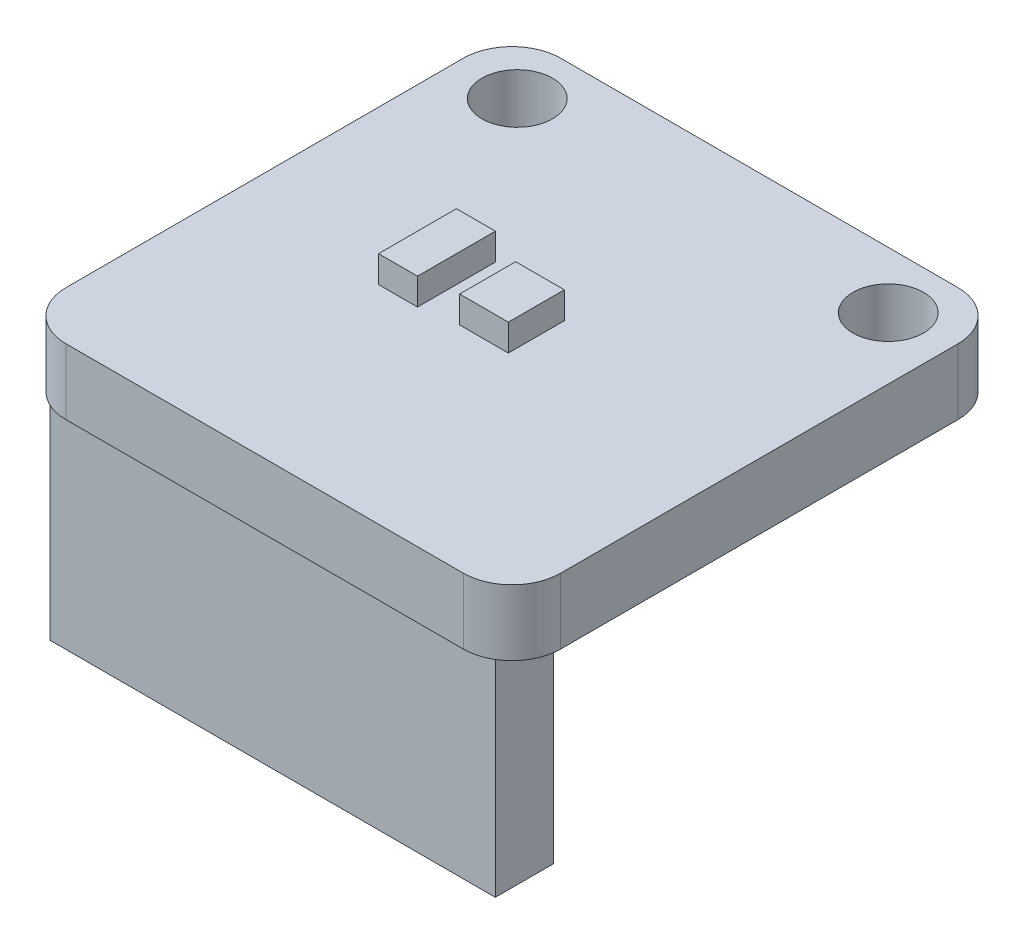
ISO-10303-21;
HEADER;
FILE_DESCRIPTION(('STEP AP214'),'2;1');
FILE_NAME('part.step','',(''),(''),'','','');
FILE_SCHEMA(('AUTOMOTIVE_DESIGN { 1 0 10303 214 1 1 1 1 }'));
ENDSEC;
DATA;
#1=APPLICATION_CONTEXT('core data for automotive mechanical design processes');
#2=APPLICATION_PROTOCOL_DEFINITION('international standard','automotive_design',2000,#1);
#3=PRODUCT_CONTEXT('',#1,'mechanical');
#4=PRODUCT('Part','Part','',(#3));
#5=PRODUCT_RELATED_PRODUCT_CATEGORY('part','',(#4));
#6=PRODUCT_DEFINITION_FORMATION('','',#4);
#7=PRODUCT_DEFINITION_CONTEXT('part definition',#1,'design');
#8=PRODUCT_DEFINITION('design','',#6,#7);
#9=PRODUCT_DEFINITION_SHAPE('','',#8);
#10=(LENGTH_UNIT() NAMED_UNIT(*) SI_UNIT(.MILLI.,.METRE.));
#11=(NAMED_UNIT(*) PLANE_ANGLE_UNIT() SI_UNIT($,.RADIAN.));
#12=(NAMED_UNIT(*) SI_UNIT($,.STERADIAN.) SOLID_ANGLE_UNIT());
#13=UNCERTAINTY_MEASURE_WITH_UNIT(LENGTH_MEASURE(1.E-05),#10,'distance_accuracy_value','');
#14=(GEOMETRIC_REPRESENTATION_CONTEXT(3) GLOBAL_UNCERTAINTY_ASSIGNED_CONTEXT((#13)) GLOBAL_UNIT_ASSIGNED_CONTEXT((#10,
#11,#12)) REPRESENTATION_CONTEXT('',''));
#15=CARTESIAN_POINT('',(0.,0.,0.));
#16=DIRECTION('',(0.,0.,1.));
#17=DIRECTION('',(1.,0.,0.));
#18=AXIS2_PLACEMENT_3D('',#15,#16,#17);
#19=CARTESIAN_POINT('',(0.,2.7,0.));
#20=DIRECTION('',(0.,-1.,0.));
#21=DIRECTION('',(0.,0.,-1.));
#22=AXIS2_PLACEMENT_3D('',#19,#20,#21);
#23=PLANE('',#22);
#24=DIRECTION('',(0.,0.,1.));
#25=VECTOR('',#24,1.);
#26=CARTESIAN_POINT('',(-0.745999999999998,2.7,-0.896000000000001));
#27=LINE('',#26,#25);
#28=CARTESIAN_POINT('',(-0.745999999999998,2.7,-0.896000000000001));
#29=VERTEX_POINT('',#28);
#30=CARTESIAN_POINT('',(-0.745999999999998,2.7,1.404));
#31=VERTEX_POINT('',#30);
#32=EDGE_CURVE('E249',#29,#31,#27,.T.);
#33=ORIENTED_EDGE('',*,*,#32,.F.);
#34=DIRECTION('',(-1.,0.,0.));
#35=VECTOR('',#34,1.);
#36=CARTESIAN_POINT('',(-0.745999999999998,2.7,-0.896000000000001));
#37=LINE('',#36,#35);
#38=CARTESIAN_POINT('',(1.254,2.7,-0.896000000000001));
#39=VERTEX_POINT('',#38);
#40=EDGE_CURVE('E254',#39,#29,#37,.T.);
#41=ORIENTED_EDGE('',*,*,#40,.F.);
#42=DIRECTION('',(0.,0.,-1.));
#43=VECTOR('',#42,1.);
#44=CARTESIAN_POINT('',(1.254,2.7,-0.896000000000001));
#45=LINE('',#44,#43);
#46=CARTESIAN_POINT('',(1.254,2.7,1.404));
#47=VERTEX_POINT('',#46);
#48=EDGE_CURVE('E266',#47,#39,#45,.T.);
#49=ORIENTED_EDGE('',*,*,#48,.F.);
#50=DIRECTION('',(1.,0.,0.));
#51=VECTOR('',#50,1.);
#52=CARTESIAN_POINT('',(-0.745999999999998,2.7,1.404));
#53=LINE('',#52,#51);
#54=EDGE_CURVE('E263',#31,#47,#53,.T.);
#55=ORIENTED_EDGE('',*,*,#54,.F.);
#56=EDGE_LOOP('',(#33,#41,#49,#55));
#57=FACE_BOUND('',#56,.T.);
#58=CARTESIAN_POINT('',(-7.62,2.7,-7.83500067424431));
#59=DIRECTION('',(0.,1.,0.));
#60=DIRECTION('',(0.,0.,1.));
#61=AXIS2_PLACEMENT_3D('',#58,#59,#60);
#62=CIRCLE('',#61,1.45);
#63=CARTESIAN_POINT('',(-7.62,2.7,-6.38500067424432));
#64=VERTEX_POINT('',#63);
#65=EDGE_CURVE('E282',#64,#64,#62,.T.);
#66=ORIENTED_EDGE('',*,*,#65,.F.);
#67=EDGE_LOOP('',(#66));
#68=FACE_BOUND('',#67,.T.);
#69=CARTESIAN_POINT('',(7.62,2.7,-7.83500067424431));
#70=DIRECTION('',(0.,1.,0.));
#71=DIRECTION('',(0.,0.,1.));
#72=AXIS2_PLACEMENT_3D('',#69,#70,#71);
#73=CIRCLE('',#72,1.45);
#74=CARTESIAN_POINT('',(7.62,2.7,-6.38500067424432));
#75=VERTEX_POINT('',#74);
#76=EDGE_CURVE('E288',#75,#75,#73,.T.);
#77=ORIENTED_EDGE('',*,*,#76,.F.);
#78=EDGE_LOOP('',(#77));
#79=FACE_BOUND('',#78,.T.);
#80=DIRECTION('',(0.,0.,1.));
#81=VECTOR('',#80,1.);
#82=CARTESIAN_POINT('',(-10.16,2.7,10.16));
#83=LINE('',#82,#81);
#84=CARTESIAN_POINT('',(-10.16,2.7,-8.16));
#85=VERTEX_POINT('',#84);
#86=CARTESIAN_POINT('',(-10.16,2.7,8.16));
#87=VERTEX_POINT('',#86);
#88=EDGE_CURVE('E295',#85,#87,#83,.T.);
#89=ORIENTED_EDGE('',*,*,#88,.T.);
#90=CARTESIAN_POINT('',(-8.16,2.7,8.16));
#91=DIRECTION('',(0.,-1.,0.));
#92=DIRECTION('',(0.,0.,-1.));
#93=AXIS2_PLACEMENT_3D('',#90,#91,#92);
#94=CIRCLE('',#93,2.);
#95=CARTESIAN_POINT('',(-8.16,2.7,10.16));
#96=VERTEX_POINT('',#95);
#97=EDGE_CURVE('E338',#87,#96,#94,.F.);
#98=ORIENTED_EDGE('',*,*,#97,.T.);
#99=DIRECTION('',(1.,0.,0.));
#100=VECTOR('',#99,1.);
#101=CARTESIAN_POINT('',(-10.16,2.7,10.16));
#102=LINE('',#101,#100);
#103=CARTESIAN_POINT('',(8.16,2.7,10.16));
#104=VERTEX_POINT('',#103);
#105=EDGE_CURVE('E298',#96,#104,#102,.T.);
#106=ORIENTED_EDGE('',*,*,#105,.T.);
#107=CARTESIAN_POINT('',(8.16,2.7,8.16));
#108=DIRECTION('',(0.,-1.,0.));
#109=DIRECTION('',(0.,0.,-1.));
#110=AXIS2_PLACEMENT_3D('',#107,#108,#109);
#111=CIRCLE('',#110,2.);
#112=CARTESIAN_POINT('',(10.16,2.7,8.16));
#113=VERTEX_POINT('',#112);
#114=EDGE_CURVE('E336',#104,#113,#111,.F.);
#115=ORIENTED_EDGE('',*,*,#114,.T.);
#116=DIRECTION('',(0.,0.,-1.));
#117=VECTOR('',#116,1.);
#118=CARTESIAN_POINT('',(10.16,2.7,10.16));
#119=LINE('',#118,#117);
#120=CARTESIAN_POINT('',(10.16,2.7,-8.16));
#121=VERTEX_POINT('',#120);
#122=EDGE_CURVE('E302',#113,#121,#119,.T.);
#123=ORIENTED_EDGE('',*,*,#122,.T.);
#124=CARTESIAN_POINT('',(8.16,2.7,-8.16));
#125=DIRECTION('',(0.,-1.,0.));
#126=DIRECTION('',(0.,0.,-1.));
#127=AXIS2_PLACEMENT_3D('',#124,#125,#126);
#128=CIRCLE('',#127,2.);
#129=CARTESIAN_POINT('',(8.16,2.7,-10.16));
#130=VERTEX_POINT('',#129);
#131=EDGE_CURVE('E57',#121,#130,#128,.F.);
#132=ORIENTED_EDGE('',*,*,#131,.T.);
#133=DIRECTION('',(-1.,0.,0.));
#134=VECTOR('',#133,1.);
#135=CARTESIAN_POINT('',(-10.16,2.7,-10.16));
#136=LINE('',#135,#134);
#137=CARTESIAN_POINT('',(-8.16,2.7,-10.16));
#138=VERTEX_POINT('',#137);
#139=EDGE_CURVE('E304',#130,#138,#136,.T.);
#140=ORIENTED_EDGE('',*,*,#139,.T.);
#141=CARTESIAN_POINT('',(-8.16,2.7,-8.16));
#142=DIRECTION('',(0.,-1.,0.));
#143=DIRECTION('',(0.,0.,-1.));
#144=AXIS2_PLACEMENT_3D('',#141,#142,#143);
#145=CIRCLE('',#144,2.);
#146=EDGE_CURVE('E333',#138,#85,#145,.F.);
#147=ORIENTED_EDGE('',*,*,#146,.T.);
#148=EDGE_LOOP('',(#89,#98,#106,#115,#123,#132,#140,#147));
#149=FACE_BOUND('',#148,.T.);
#150=DIRECTION('',(0.,0.,1.));
#151=VECTOR('',#150,1.);
#152=CARTESIAN_POINT('',(-3.848,2.7,-1.566));
#153=LINE('',#152,#151);
#154=CARTESIAN_POINT('',(-3.848,2.7,-1.566));
#155=VERTEX_POINT('',#154);
#156=CARTESIAN_POINT('',(-3.848,2.7,1.634));
#157=VERTEX_POINT('',#156);
#158=EDGE_CURVE('E212',#155,#157,#153,.T.);
#159=ORIENTED_EDGE('',*,*,#158,.F.);
#160=DIRECTION('',(-1.,0.,0.));
#161=VECTOR('',#160,1.);
#162=CARTESIAN_POINT('',(-3.848,2.7,-1.566));
#163=LINE('',#162,#161);
#164=CARTESIAN_POINT('',(-2.248,2.7,-1.566));
#165=VERTEX_POINT('',#164);
#166=EDGE_CURVE('E221',#165,#155,#163,.T.);
#167=ORIENTED_EDGE('',*,*,#166,.F.);
#168=DIRECTION('',(0.,0.,-1.));
#169=VECTOR('',#168,1.);
#170=CARTESIAN_POINT('',(-2.248,2.7,-1.566));
#171=LINE('',#170,#169);
#172=CARTESIAN_POINT('',(-2.248,2.7,1.634));
#173=VERTEX_POINT('',#172);
#174=EDGE_CURVE('E233',#173,#165,#171,.T.);
#175=ORIENTED_EDGE('',*,*,#174,.F.);
#176=DIRECTION('',(1.,0.,0.));
#177=VECTOR('',#176,1.);
#178=CARTESIAN_POINT('',(-3.848,2.7,1.634));
#179=LINE('',#178,#177);
#180=EDGE_CURVE('E230',#157,#173,#179,.T.);
#181=ORIENTED_EDGE('',*,*,#180,.F.);
#182=EDGE_LOOP('',(#159,#167,#175,#181));
#183=FACE_BOUND('',#182,.T.);
#184=ADVANCED_FACE('F36',(#57,#68,#79,#149,#183),#23,.F.);
#185=CARTESIAN_POINT('',(-10.16,2.7,10.16));
#186=DIRECTION('',(1.,0.,0.));
#187=DIRECTION('',(0.,0.,-1.));
#188=AXIS2_PLACEMENT_3D('',#185,#186,#187);
#189=PLANE('',#188);
#190=DIRECTION('',(0.,0.,1.));
#191=VECTOR('',#190,1.);
#192=CARTESIAN_POINT('',(-10.16,0.,10.16));
#193=LINE('',#192,#191);
#194=CARTESIAN_POINT('',(-10.16,0.,-8.16));
#195=VERTEX_POINT('',#194);
#196=CARTESIAN_POINT('',(-10.16,0.,8.16));
#197=VERTEX_POINT('',#196);
#198=EDGE_CURVE('E294',#195,#197,#193,.T.);
#199=ORIENTED_EDGE('',*,*,#198,.T.);
#200=DIRECTION('',(0.,-1.,0.));
#201=VECTOR('',#200,1.);
#202=CARTESIAN_POINT('',(-10.16,2.7,8.16));
#203=LINE('',#202,#201);
#204=EDGE_CURVE('E331',#197,#87,#203,.F.);
#205=ORIENTED_EDGE('',*,*,#204,.T.);
#206=ORIENTED_EDGE('',*,*,#88,.F.);
#207=DIRECTION('',(0.,-1.,0.));
#208=VECTOR('',#207,1.);
#209=CARTESIAN_POINT('',(-10.16,2.7,-8.16));
#210=LINE('',#209,#208);
#211=EDGE_CURVE('E328',#85,#195,#210,.T.);
#212=ORIENTED_EDGE('',*,*,#211,.T.);
#213=EDGE_LOOP('',(#199,#205,#206,#212));
#214=FACE_BOUND('',#213,.T.);
#215=ADVANCED_FACE('F367',(#214),#189,.F.);
#216=CARTESIAN_POINT('',(-10.16,2.7,10.16));
#217=DIRECTION('',(0.,0.,-1.));
#218=DIRECTION('',(-1.,0.,0.));
#219=AXIS2_PLACEMENT_3D('',#216,#217,#218);
#220=PLANE('',#219);
#221=ORIENTED_EDGE('',*,*,#105,.F.);
#222=DIRECTION('',(0.,-1.,0.));
#223=VECTOR('',#222,1.);
#224=CARTESIAN_POINT('',(-8.16,2.7,10.16));
#225=LINE('',#224,#223);
#226=CARTESIAN_POINT('',(-8.16,0.,10.16));
#227=VERTEX_POINT('',#226);
#228=EDGE_CURVE('E317',#96,#227,#225,.T.);
#229=ORIENTED_EDGE('',*,*,#228,.T.);
#230=DIRECTION('',(1.,0.,0.));
#231=VECTOR('',#230,1.);
#232=CARTESIAN_POINT('',(-10.16,0.,10.16));
#233=LINE('',#232,#231);
#234=CARTESIAN_POINT('',(8.16,0.,10.16));
#235=VERTEX_POINT('',#234);
#236=EDGE_CURVE('E309',#227,#235,#233,.T.);
#237=ORIENTED_EDGE('',*,*,#236,.T.);
#238=DIRECTION('',(0.,-1.,0.));
#239=VECTOR('',#238,1.);
#240=CARTESIAN_POINT('',(8.16,2.7,10.16));
#241=LINE('',#240,#239);
#242=EDGE_CURVE('E306',#235,#104,#241,.F.);
#243=ORIENTED_EDGE('',*,*,#242,.T.);
#244=EDGE_LOOP('',(#221,#229,#237,#243));
#245=FACE_BOUND('',#244,.T.);
#246=ADVANCED_FACE('F375',(#245),#220,.F.);
#247=CARTESIAN_POINT('',(10.16,2.7,10.16));
#248=DIRECTION('',(-1.,0.,0.));
#249=DIRECTION('',(0.,0.,1.));
#250=AXIS2_PLACEMENT_3D('',#247,#248,#249);
#251=PLANE('',#250);
#252=ORIENTED_EDGE('',*,*,#122,.F.);
#253=DIRECTION('',(0.,-1.,0.));
#254=VECTOR('',#253,1.);
#255=CARTESIAN_POINT('',(10.16,2.7,8.16));
#256=LINE('',#255,#254);
#257=CARTESIAN_POINT('',(10.16,0.,8.16));
#258=VERTEX_POINT('',#257);
#259=EDGE_CURVE('E342',#113,#258,#256,.T.);
#260=ORIENTED_EDGE('',*,*,#259,.T.);
#261=DIRECTION('',(0.,0.,-1.));
#262=VECTOR('',#261,1.);
#263=CARTESIAN_POINT('',(10.16,0.,10.16));
#264=LINE('',#263,#262);
#265=CARTESIAN_POINT('',(10.16,0.,-8.16));
#266=VERTEX_POINT('',#265);
#267=EDGE_CURVE('E312',#258,#266,#264,.T.);
#268=ORIENTED_EDGE('',*,*,#267,.T.);
#269=DIRECTION('',(0.,-1.,0.));
#270=VECTOR('',#269,1.);
#271=CARTESIAN_POINT('',(10.16,2.7,-8.16));
#272=LINE('',#271,#270);
#273=EDGE_CURVE('E340',#266,#121,#272,.F.);
#274=ORIENTED_EDGE('',*,*,#273,.T.);
#275=EDGE_LOOP('',(#252,#260,#268,#274));
#276=FACE_BOUND('',#275,.T.);
#277=ADVANCED_FACE('F348',(#276),#251,.F.);
#278=CARTESIAN_POINT('',(-10.16,2.7,-10.16));
#279=DIRECTION('',(0.,0.,1.));
#280=DIRECTION('',(1.,0.,0.));
#281=AXIS2_PLACEMENT_3D('',#278,#279,#280);
#282=PLANE('',#281);
#283=ORIENTED_EDGE('',*,*,#139,.F.);
#284=DIRECTION('',(0.,-1.,0.));
#285=VECTOR('',#284,1.);
#286=CARTESIAN_POINT('',(8.16,2.7,-10.16));
#287=LINE('',#286,#285);
#288=CARTESIAN_POINT('',(8.16,0.,-10.16));
#289=VERTEX_POINT('',#288);
#290=EDGE_CURVE('E11',#130,#289,#287,.T.);
#291=ORIENTED_EDGE('',*,*,#290,.T.);
#292=DIRECTION('',(-1.,0.,0.));
#293=VECTOR('',#292,1.);
#294=CARTESIAN_POINT('',(-10.16,0.,-10.16));
#295=LINE('',#294,#293);
#296=CARTESIAN_POINT('',(-8.16,0.,-10.16));
#297=VERTEX_POINT('',#296);
#298=EDGE_CURVE('E299',#289,#297,#295,.T.);
#299=ORIENTED_EDGE('',*,*,#298,.T.);
#300=DIRECTION('',(0.,-1.,0.));
#301=VECTOR('',#300,1.);
#302=CARTESIAN_POINT('',(-8.16,2.7,-10.16));
#303=LINE('',#302,#301);
#304=EDGE_CURVE('E44',#297,#138,#303,.F.);
#305=ORIENTED_EDGE('',*,*,#304,.T.);
#306=EDGE_LOOP('',(#283,#291,#299,#305));
#307=FACE_BOUND('',#306,.T.);
#308=ADVANCED_FACE('F359',(#307),#282,.F.);
#309=CARTESIAN_POINT('',(0.,0.,0.));
#310=DIRECTION('',(0.,-1.,0.));
#311=DIRECTION('',(0.,0.,-1.));
#312=AXIS2_PLACEMENT_3D('',#309,#310,#311);
#313=PLANE('',#312);
#314=DIRECTION('',(0.,0.,1.));
#315=VECTOR('',#314,1.);
#316=CARTESIAN_POINT('',(-9.15,0.,7.436));
#317=LINE('',#316,#315);
#318=CARTESIAN_POINT('',(-9.15,0.,7.436));
#319=VERTEX_POINT('',#318);
#320=CARTESIAN_POINT('',(-9.15,0.,9.836));
#321=VERTEX_POINT('',#320);
#322=EDGE_CURVE('E207',#319,#321,#317,.T.);
#323=ORIENTED_EDGE('',*,*,#322,.T.);
#324=DIRECTION('',(1.,0.,0.));
#325=VECTOR('',#324,1.);
#326=CARTESIAN_POINT('',(-9.15,0.,9.836));
#327=LINE('',#326,#325);
#328=CARTESIAN_POINT('',(9.15,0.,9.836));
#329=VERTEX_POINT('',#328);
#330=EDGE_CURVE('E180',#321,#329,#327,.T.);
#331=ORIENTED_EDGE('',*,*,#330,.T.);
#332=DIRECTION('',(0.,0.,-1.));
#333=VECTOR('',#332,1.);
#334=CARTESIAN_POINT('',(9.15,0.,7.436));
#335=LINE('',#334,#333);
#336=CARTESIAN_POINT('',(9.15,0.,7.436));
#337=VERTEX_POINT('',#336);
#338=EDGE_CURVE('E202',#329,#337,#335,.T.);
#339=ORIENTED_EDGE('',*,*,#338,.T.);
#340=DIRECTION('',(-1.,0.,0.));
#341=VECTOR('',#340,1.);
#342=CARTESIAN_POINT('',(-9.15,0.,7.436));
#343=LINE('',#342,#341);
#344=EDGE_CURVE('E200',#337,#319,#343,.T.);
#345=ORIENTED_EDGE('',*,*,#344,.T.);
#346=EDGE_LOOP('',(#323,#331,#339,#345));
#347=FACE_BOUND('',#346,.T.);
#348=CARTESIAN_POINT('',(-7.62,0.,-7.83500067424431));
#349=DIRECTION('',(0.,1.,0.));
#350=DIRECTION('',(0.,0.,1.));
#351=AXIS2_PLACEMENT_3D('',#348,#349,#350);
#352=CIRCLE('',#351,1.45);
#353=CARTESIAN_POINT('',(-7.62,0.,-6.38500067424432));
#354=VERTEX_POINT('',#353);
#355=EDGE_CURVE('E285',#354,#354,#352,.T.);
#356=ORIENTED_EDGE('',*,*,#355,.T.);
#357=EDGE_LOOP('',(#356));
#358=FACE_BOUND('',#357,.T.);
#359=CARTESIAN_POINT('',(7.62,0.,-7.83500067424431));
#360=DIRECTION('',(0.,1.,0.));
#361=DIRECTION('',(0.,0.,1.));
#362=AXIS2_PLACEMENT_3D('',#359,#360,#361);
#363=CIRCLE('',#362,1.45);
#364=CARTESIAN_POINT('',(7.62,0.,-6.38500067424432));
#365=VERTEX_POINT('',#364);
#366=EDGE_CURVE('E291',#365,#365,#363,.T.);
#367=ORIENTED_EDGE('',*,*,#366,.T.);
#368=EDGE_LOOP('',(#367));
#369=FACE_BOUND('',#368,.T.);
#370=ORIENTED_EDGE('',*,*,#236,.F.);
#371=CARTESIAN_POINT('',(-8.16,0.,8.16));
#372=DIRECTION('',(0.,-1.,0.));
#373=DIRECTION('',(0.,0.,-1.));
#374=AXIS2_PLACEMENT_3D('',#371,#372,#373);
#375=CIRCLE('',#374,2.);
#376=EDGE_CURVE('E326',#227,#197,#375,.T.);
#377=ORIENTED_EDGE('',*,*,#376,.T.);
#378=ORIENTED_EDGE('',*,*,#198,.F.);
#379=CARTESIAN_POINT('',(-8.16,0.,-8.16));
#380=DIRECTION('',(0.,-1.,0.));
#381=DIRECTION('',(0.,0.,-1.));
#382=AXIS2_PLACEMENT_3D('',#379,#380,#381);
#383=CIRCLE('',#382,2.);
#384=EDGE_CURVE('E320',#195,#297,#383,.T.);
#385=ORIENTED_EDGE('',*,*,#384,.T.);
#386=ORIENTED_EDGE('',*,*,#298,.F.);
#387=CARTESIAN_POINT('',(8.16,0.,-8.16));
#388=DIRECTION('',(0.,-1.,0.));
#389=DIRECTION('',(0.,0.,-1.));
#390=AXIS2_PLACEMENT_3D('',#387,#388,#389);
#391=CIRCLE('',#390,2.);
#392=EDGE_CURVE('E322',#289,#266,#391,.T.);
#393=ORIENTED_EDGE('',*,*,#392,.T.);
#394=ORIENTED_EDGE('',*,*,#267,.F.);
#395=CARTESIAN_POINT('',(8.16,0.,8.16));
#396=DIRECTION('',(0.,-1.,0.));
#397=DIRECTION('',(0.,0.,-1.));
#398=AXIS2_PLACEMENT_3D('',#395,#396,#397);
#399=CIRCLE('',#398,2.);
#400=EDGE_CURVE('E324',#258,#235,#399,.T.);
#401=ORIENTED_EDGE('',*,*,#400,.T.);
#402=EDGE_LOOP('',(#370,#377,#378,#385,#386,#393,#394,#401));
#403=FACE_BOUND('',#402,.T.);
#404=ADVANCED_FACE('F354',(#347,#358,#369,#403),#313,.T.);
#405=CARTESIAN_POINT('',(7.62,2.7,-7.83500067424431));
#406=DIRECTION('',(0.,1.,0.));
#407=DIRECTION('',(0.,0.,1.));
#408=AXIS2_PLACEMENT_3D('',#405,#406,#407);
#409=CYLINDRICAL_SURFACE('',#408,1.45);
#410=ORIENTED_EDGE('',*,*,#366,.F.);
#411=EDGE_LOOP('',(#410));
#412=FACE_BOUND('',#411,.T.);
#413=ORIENTED_EDGE('',*,*,#76,.T.);
#414=EDGE_LOOP('',(#413));
#415=FACE_BOUND('',#414,.T.);
#416=ADVANCED_FACE('F395',(#412,#415),#409,.F.);
#417=CARTESIAN_POINT('',(-7.62,2.7,-7.83500067424431));
#418=DIRECTION('',(0.,1.,0.));
#419=DIRECTION('',(0.,0.,1.));
#420=AXIS2_PLACEMENT_3D('',#417,#418,#419);
#421=CYLINDRICAL_SURFACE('',#420,1.45);
#422=ORIENTED_EDGE('',*,*,#355,.F.);
#423=EDGE_LOOP('',(#422));
#424=FACE_BOUND('',#423,.T.);
#425=ORIENTED_EDGE('',*,*,#65,.T.);
#426=EDGE_LOOP('',(#425));
#427=FACE_BOUND('',#426,.T.);
#428=ADVANCED_FACE('F428',(#424,#427),#421,.F.);
#429=CARTESIAN_POINT('',(-0.745999999999998,3.8,-0.896000000000001));
#430=DIRECTION('',(1.,0.,0.));
#431=DIRECTION('',(0.,0.,-1.));
#432=AXIS2_PLACEMENT_3D('',#429,#430,#431);
#433=PLANE('',#432);
#434=ORIENTED_EDGE('',*,*,#32,.T.);
#435=DIRECTION('',(0.,-1.,0.));
#436=VECTOR('',#435,1.);
#437=CARTESIAN_POINT('',(-0.745999999999998,3.8,1.404));
#438=LINE('',#437,#436);
#439=CARTESIAN_POINT('',(-0.745999999999998,3.8,1.404));
#440=VERTEX_POINT('',#439);
#441=EDGE_CURVE('E279',#440,#31,#438,.T.);
#442=ORIENTED_EDGE('',*,*,#441,.F.);
#443=DIRECTION('',(0.,0.,1.));
#444=VECTOR('',#443,1.);
#445=CARTESIAN_POINT('',(-0.745999999999998,3.8,-0.896000000000001));
#446=LINE('',#445,#444);
#447=CARTESIAN_POINT('',(-0.745999999999998,3.8,-0.896000000000001));
#448=VERTEX_POINT('',#447);
#449=EDGE_CURVE('E250',#448,#440,#446,.T.);
#450=ORIENTED_EDGE('',*,*,#449,.F.);
#451=DIRECTION('',(0.,-1.,0.));
#452=VECTOR('',#451,1.);
#453=CARTESIAN_POINT('',(-0.745999999999998,3.8,-0.896000000000001));
#454=LINE('',#453,#452);
#455=EDGE_CURVE('E260',#448,#29,#454,.T.);
#456=ORIENTED_EDGE('',*,*,#455,.T.);
#457=EDGE_LOOP('',(#434,#442,#450,#456));
#458=FACE_BOUND('',#457,.T.);
#459=ADVANCED_FACE('F435',(#458),#433,.F.);
#460=CARTESIAN_POINT('',(-0.745999999999998,3.8,1.404));
#461=DIRECTION('',(0.,0.,-1.));
#462=DIRECTION('',(-1.,0.,0.));
#463=AXIS2_PLACEMENT_3D('',#460,#461,#462);
#464=PLANE('',#463);
#465=ORIENTED_EDGE('',*,*,#54,.T.);
#466=DIRECTION('',(0.,-1.,0.));
#467=VECTOR('',#466,1.);
#468=CARTESIAN_POINT('',(1.254,3.8,1.404));
#469=LINE('',#468,#467);
#470=CARTESIAN_POINT('',(1.254,3.8,1.404));
#471=VERTEX_POINT('',#470);
#472=EDGE_CURVE('E276',#471,#47,#469,.T.);
#473=ORIENTED_EDGE('',*,*,#472,.F.);
#474=DIRECTION('',(1.,0.,0.));
#475=VECTOR('',#474,1.);
#476=CARTESIAN_POINT('',(-0.745999999999998,3.8,1.404));
#477=LINE('',#476,#475);
#478=EDGE_CURVE('E253',#440,#471,#477,.T.);
#479=ORIENTED_EDGE('',*,*,#478,.F.);
#480=ORIENTED_EDGE('',*,*,#441,.T.);
#481=EDGE_LOOP('',(#465,#473,#479,#480));
#482=FACE_BOUND('',#481,.T.);
#483=ADVANCED_FACE('F443',(#482),#464,.F.);
#484=CARTESIAN_POINT('',(1.254,3.8,-0.896000000000001));
#485=DIRECTION('',(-1.,0.,0.));
#486=DIRECTION('',(0.,0.,1.));
#487=AXIS2_PLACEMENT_3D('',#484,#485,#486);
#488=PLANE('',#487);
#489=ORIENTED_EDGE('',*,*,#48,.T.);
#490=DIRECTION('',(0.,-1.,0.));
#491=VECTOR('',#490,1.);
#492=CARTESIAN_POINT('',(1.254,3.8,-0.896000000000001));
#493=LINE('',#492,#491);
#494=CARTESIAN_POINT('',(1.254,3.8,-0.896000000000001));
#495=VERTEX_POINT('',#494);
#496=EDGE_CURVE('E273',#495,#39,#493,.T.);
#497=ORIENTED_EDGE('',*,*,#496,.F.);
#498=DIRECTION('',(0.,0.,-1.));
#499=VECTOR('',#498,1.);
#500=CARTESIAN_POINT('',(1.254,3.8,-0.896000000000001));
#501=LINE('',#500,#499);
#502=EDGE_CURVE('E256',#471,#495,#501,.T.);
#503=ORIENTED_EDGE('',*,*,#502,.F.);
#504=ORIENTED_EDGE('',*,*,#472,.T.);
#505=EDGE_LOOP('',(#489,#497,#503,#504));
#506=FACE_BOUND('',#505,.T.);
#507=ADVANCED_FACE('F451',(#506),#488,.F.);
#508=CARTESIAN_POINT('',(-0.745999999999998,3.8,-0.896000000000001));
#509=DIRECTION('',(0.,0.,1.));
#510=DIRECTION('',(1.,0.,0.));
#511=AXIS2_PLACEMENT_3D('',#508,#509,#510);
#512=PLANE('',#511);
#513=ORIENTED_EDGE('',*,*,#40,.T.);
#514=ORIENTED_EDGE('',*,*,#455,.F.);
#515=DIRECTION('',(-1.,0.,0.));
#516=VECTOR('',#515,1.);
#517=CARTESIAN_POINT('',(-0.745999999999998,3.8,-0.896000000000001));
#518=LINE('',#517,#516);
#519=EDGE_CURVE('E258',#495,#448,#518,.T.);
#520=ORIENTED_EDGE('',*,*,#519,.F.);
#521=ORIENTED_EDGE('',*,*,#496,.T.);
#522=EDGE_LOOP('',(#513,#514,#520,#521));
#523=FACE_BOUND('',#522,.T.);
#524=ADVANCED_FACE('F460',(#523),#512,.F.);
#525=CARTESIAN_POINT('',(0.,3.8,0.));
#526=DIRECTION('',(0.,1.,0.));
#527=DIRECTION('',(0.,0.,1.));
#528=AXIS2_PLACEMENT_3D('',#525,#526,#527);
#529=PLANE('',#528);
#530=ORIENTED_EDGE('',*,*,#449,.T.);
#531=ORIENTED_EDGE('',*,*,#478,.T.);
#532=ORIENTED_EDGE('',*,*,#502,.T.);
#533=ORIENTED_EDGE('',*,*,#519,.T.);
#534=EDGE_LOOP('',(#530,#531,#532,#533));
#535=FACE_BOUND('',#534,.T.);
#536=ADVANCED_FACE('F467',(#535),#529,.T.);
#537=CARTESIAN_POINT('',(-3.848,3.8,-1.566));
#538=DIRECTION('',(1.,0.,0.));
#539=DIRECTION('',(0.,0.,-1.));
#540=AXIS2_PLACEMENT_3D('',#537,#538,#539);
#541=PLANE('',#540);
#542=ORIENTED_EDGE('',*,*,#158,.T.);
#543=DIRECTION('',(0.,-1.,0.));
#544=VECTOR('',#543,1.);
#545=CARTESIAN_POINT('',(-3.848,3.8,1.634));
#546=LINE('',#545,#544);
#547=CARTESIAN_POINT('',(-3.848,3.8,1.634));
#548=VERTEX_POINT('',#547);
#549=EDGE_CURVE('E246',#548,#157,#546,.T.);
#550=ORIENTED_EDGE('',*,*,#549,.F.);
#551=DIRECTION('',(0.,0.,1.));
#552=VECTOR('',#551,1.);
#553=CARTESIAN_POINT('',(-3.848,3.8,-1.566));
#554=LINE('',#553,#552);
#555=CARTESIAN_POINT('',(-3.848,3.8,-1.566));
#556=VERTEX_POINT('',#555);
#557=EDGE_CURVE('E217',#556,#548,#554,.T.);
#558=ORIENTED_EDGE('',*,*,#557,.F.);
#559=DIRECTION('',(0.,-1.,0.));
#560=VECTOR('',#559,1.);
#561=CARTESIAN_POINT('',(-3.848,3.8,-1.566));
#562=LINE('',#561,#560);
#563=EDGE_CURVE('E227',#556,#155,#562,.T.);
#564=ORIENTED_EDGE('',*,*,#563,.T.);
#565=EDGE_LOOP('',(#542,#550,#558,#564));
#566=FACE_BOUND('',#565,.T.);
#567=ADVANCED_FACE('F474',(#566),#541,.F.);
#568=CARTESIAN_POINT('',(-3.848,3.8,1.634));
#569=DIRECTION('',(0.,0.,-1.));
#570=DIRECTION('',(-1.,0.,0.));
#571=AXIS2_PLACEMENT_3D('',#568,#569,#570);
#572=PLANE('',#571);
#573=ORIENTED_EDGE('',*,*,#180,.T.);
#574=DIRECTION('',(0.,-1.,0.));
#575=VECTOR('',#574,1.);
#576=CARTESIAN_POINT('',(-2.248,3.8,1.634));
#577=LINE('',#576,#575);
#578=CARTESIAN_POINT('',(-2.248,3.8,1.634));
#579=VERTEX_POINT('',#578);
#580=EDGE_CURVE('E243',#579,#173,#577,.T.);
#581=ORIENTED_EDGE('',*,*,#580,.F.);
#582=DIRECTION('',(1.,0.,0.));
#583=VECTOR('',#582,1.);
#584=CARTESIAN_POINT('',(-3.848,3.8,1.634));
#585=LINE('',#584,#583);
#586=EDGE_CURVE('E220',#548,#579,#585,.T.);
#587=ORIENTED_EDGE('',*,*,#586,.F.);
#588=ORIENTED_EDGE('',*,*,#549,.T.);
#589=EDGE_LOOP('',(#573,#581,#587,#588));
#590=FACE_BOUND('',#589,.T.);
#591=ADVANCED_FACE('F483',(#590),#572,.F.);
#592=CARTESIAN_POINT('',(-2.248,3.8,-1.566));
#593=DIRECTION('',(-1.,0.,0.));
#594=DIRECTION('',(0.,0.,1.));
#595=AXIS2_PLACEMENT_3D('',#592,#593,#594);
#596=PLANE('',#595);
#597=ORIENTED_EDGE('',*,*,#174,.T.);
#598=DIRECTION('',(0.,-1.,0.));
#599=VECTOR('',#598,1.);
#600=CARTESIAN_POINT('',(-2.248,3.8,-1.566));
#601=LINE('',#600,#599);
#602=CARTESIAN_POINT('',(-2.248,3.8,-1.566));
#603=VERTEX_POINT('',#602);
#604=EDGE_CURVE('E240',#603,#165,#601,.T.);
#605=ORIENTED_EDGE('',*,*,#604,.F.);
#606=DIRECTION('',(0.,0.,-1.));
#607=VECTOR('',#606,1.);
#608=CARTESIAN_POINT('',(-2.248,3.8,-1.566));
#609=LINE('',#608,#607);
#610=EDGE_CURVE('E223',#579,#603,#609,.T.);
#611=ORIENTED_EDGE('',*,*,#610,.F.);
#612=ORIENTED_EDGE('',*,*,#580,.T.);
#613=EDGE_LOOP('',(#597,#605,#611,#612));
#614=FACE_BOUND('',#613,.T.);
#615=ADVANCED_FACE('F492',(#614),#596,.F.);
#616=CARTESIAN_POINT('',(-3.848,3.8,-1.566));
#617=DIRECTION('',(0.,0.,1.));
#618=DIRECTION('',(1.,0.,0.));
#619=AXIS2_PLACEMENT_3D('',#616,#617,#618);
#620=PLANE('',#619);
#621=ORIENTED_EDGE('',*,*,#166,.T.);
#622=ORIENTED_EDGE('',*,*,#563,.F.);
#623=DIRECTION('',(-1.,0.,0.));
#624=VECTOR('',#623,1.);
#625=CARTESIAN_POINT('',(-3.848,3.8,-1.566));
#626=LINE('',#625,#624);
#627=EDGE_CURVE('E225',#603,#556,#626,.T.);
#628=ORIENTED_EDGE('',*,*,#627,.F.);
#629=ORIENTED_EDGE('',*,*,#604,.T.);
#630=EDGE_LOOP('',(#621,#622,#628,#629));
#631=FACE_BOUND('',#630,.T.);
#632=ADVANCED_FACE('F499',(#631),#620,.F.);
#633=CARTESIAN_POINT('',(0.,3.8,0.));
#634=DIRECTION('',(0.,1.,0.));
#635=DIRECTION('',(0.,0.,1.));
#636=AXIS2_PLACEMENT_3D('',#633,#634,#635);
#637=PLANE('',#636);
#638=ORIENTED_EDGE('',*,*,#557,.T.);
#639=ORIENTED_EDGE('',*,*,#586,.T.);
#640=ORIENTED_EDGE('',*,*,#610,.T.);
#641=ORIENTED_EDGE('',*,*,#627,.T.);
#642=EDGE_LOOP('',(#638,#639,#640,#641));
#643=FACE_BOUND('',#642,.T.);
#644=ADVANCED_FACE('F507',(#643),#637,.T.);
#645=CARTESIAN_POINT('',(-9.15,-8.5,7.436));
#646=DIRECTION('',(-1.,0.,0.));
#647=DIRECTION('',(0.,0.,1.));
#648=AXIS2_PLACEMENT_3D('',#645,#646,#647);
#649=PLANE('',#648);
#650=ORIENTED_EDGE('',*,*,#322,.F.);
#651=DIRECTION('',(0.,1.,0.));
#652=VECTOR('',#651,1.);
#653=CARTESIAN_POINT('',(-9.15,-8.5,7.436));
#654=LINE('',#653,#652);
#655=CARTESIAN_POINT('',(-9.15,-8.5,7.436));
#656=VERTEX_POINT('',#655);
#657=EDGE_CURVE('E199',#656,#319,#654,.T.);
#658=ORIENTED_EDGE('',*,*,#657,.F.);
#659=DIRECTION('',(0.,0.,1.));
#660=VECTOR('',#659,1.);
#661=CARTESIAN_POINT('',(-9.15,-8.5,7.436));
#662=LINE('',#661,#660);
#663=CARTESIAN_POINT('',(-9.15,-8.5,9.836));
#664=VERTEX_POINT('',#663);
#665=EDGE_CURVE('E192',#656,#664,#662,.T.);
#666=ORIENTED_EDGE('',*,*,#665,.T.);
#667=DIRECTION('',(0.,1.,0.));
#668=VECTOR('',#667,1.);
#669=CARTESIAN_POINT('',(-9.15,-8.5,9.836));
#670=LINE('',#669,#668);
#671=EDGE_CURVE('E175',#664,#321,#670,.T.);
#672=ORIENTED_EDGE('',*,*,#671,.T.);
#673=EDGE_LOOP('',(#650,#658,#666,#672));
#674=FACE_BOUND('',#673,.T.);
#675=ADVANCED_FACE('F197',(#674),#649,.T.);
#676=CARTESIAN_POINT('',(-9.15,-8.5,7.436));
#677=DIRECTION('',(0.,0.,-1.));
#678=DIRECTION('',(-1.,0.,0.));
#679=AXIS2_PLACEMENT_3D('',#676,#677,#678);
#680=PLANE('',#679);
#681=ORIENTED_EDGE('',*,*,#344,.F.);
#682=DIRECTION('',(0.,1.,0.));
#683=VECTOR('',#682,1.);
#684=CARTESIAN_POINT('',(9.15,-8.5,7.436));
#685=LINE('',#684,#683);
#686=CARTESIAN_POINT('',(9.15,-8.5,7.436));
#687=VERTEX_POINT('',#686);
#688=EDGE_CURVE('E213',#687,#337,#685,.T.);
#689=ORIENTED_EDGE('',*,*,#688,.F.);
#690=DIRECTION('',(-1.,0.,0.));
#691=VECTOR('',#690,1.);
#692=CARTESIAN_POINT('',(-9.15,-8.5,7.436));
#693=LINE('',#692,#691);
#694=EDGE_CURVE('E185',#687,#656,#693,.T.);
#695=ORIENTED_EDGE('',*,*,#694,.T.);
#696=ORIENTED_EDGE('',*,*,#657,.T.);
#697=EDGE_LOOP('',(#681,#689,#695,#696));
#698=FACE_BOUND('',#697,.T.);
#699=ADVANCED_FACE('F521',(#698),#680,.T.);
#700=CARTESIAN_POINT('',(9.15,-8.5,7.436));
#701=DIRECTION('',(1.,0.,0.));
#702=DIRECTION('',(0.,0.,-1.));
#703=AXIS2_PLACEMENT_3D('',#700,#701,#702);
#704=PLANE('',#703);
#705=ORIENTED_EDGE('',*,*,#338,.F.);
#706=DIRECTION('',(0.,1.,0.));
#707=VECTOR('',#706,1.);
#708=CARTESIAN_POINT('',(9.15,-8.5,9.836));
#709=LINE('',#708,#707);
#710=CARTESIAN_POINT('',(9.15,-8.5,9.836));
#711=VERTEX_POINT('',#710);
#712=EDGE_CURVE('E184',#711,#329,#709,.T.);
#713=ORIENTED_EDGE('',*,*,#712,.F.);
#714=DIRECTION('',(0.,0.,-1.));
#715=VECTOR('',#714,1.);
#716=CARTESIAN_POINT('',(9.15,-8.5,7.436));
#717=LINE('',#716,#715);
#718=EDGE_CURVE('E195',#711,#687,#717,.T.);
#719=ORIENTED_EDGE('',*,*,#718,.T.);
#720=ORIENTED_EDGE('',*,*,#688,.T.);
#721=EDGE_LOOP('',(#705,#713,#719,#720));
#722=FACE_BOUND('',#721,.T.);
#723=ADVANCED_FACE('F528',(#722),#704,.T.);
#724=CARTESIAN_POINT('',(-9.15,-8.5,9.836));
#725=DIRECTION('',(0.,0.,1.));
#726=DIRECTION('',(1.,0.,0.));
#727=AXIS2_PLACEMENT_3D('',#724,#725,#726);
#728=PLANE('',#727);
#729=ORIENTED_EDGE('',*,*,#330,.F.);
#730=ORIENTED_EDGE('',*,*,#671,.F.);
#731=DIRECTION('',(1.,0.,0.));
#732=VECTOR('',#731,1.);
#733=CARTESIAN_POINT('',(-9.15,-8.5,9.836));
#734=LINE('',#733,#732);
#735=EDGE_CURVE('E179',#664,#711,#734,.T.);
#736=ORIENTED_EDGE('',*,*,#735,.T.);
#737=ORIENTED_EDGE('',*,*,#712,.T.);
#738=EDGE_LOOP('',(#729,#730,#736,#737));
#739=FACE_BOUND('',#738,.T.);
#740=ADVANCED_FACE('F177',(#739),#728,.T.);
#741=CARTESIAN_POINT('',(0.,-8.5,0.));
#742=DIRECTION('',(0.,1.,0.));
#743=DIRECTION('',(0.,0.,1.));
#744=AXIS2_PLACEMENT_3D('',#741,#742,#743);
#745=PLANE('',#744);
#746=ORIENTED_EDGE('',*,*,#665,.F.);
#747=ORIENTED_EDGE('',*,*,#694,.F.);
#748=ORIENTED_EDGE('',*,*,#718,.F.);
#749=ORIENTED_EDGE('',*,*,#735,.F.);
#750=EDGE_LOOP('',(#746,#747,#748,#749));
#751=FACE_BOUND('',#750,.T.);
#752=ADVANCED_FACE('F190',(#751),#745,.F.);
#753=CARTESIAN_POINT('',(-8.16,2.7,8.16));
#754=DIRECTION('',(0.,-1.,0.));
#755=DIRECTION('',(0.,0.,-1.));
#756=AXIS2_PLACEMENT_3D('',#753,#754,#755);
#757=CYLINDRICAL_SURFACE('',#756,2.);
#758=ORIENTED_EDGE('',*,*,#97,.F.);
#759=ORIENTED_EDGE('',*,*,#204,.F.);
#760=ORIENTED_EDGE('',*,*,#376,.F.);
#761=ORIENTED_EDGE('',*,*,#228,.F.);
#762=EDGE_LOOP('',(#758,#759,#760,#761));
#763=FACE_BOUND('',#762,.T.);
#764=ADVANCED_FACE('F372',(#763),#757,.T.);
#765=CARTESIAN_POINT('',(8.16,2.7,8.16));
#766=DIRECTION('',(0.,-1.,0.));
#767=DIRECTION('',(0.,0.,-1.));
#768=AXIS2_PLACEMENT_3D('',#765,#766,#767);
#769=CYLINDRICAL_SURFACE('',#768,2.);
#770=ORIENTED_EDGE('',*,*,#114,.F.);
#771=ORIENTED_EDGE('',*,*,#242,.F.);
#772=ORIENTED_EDGE('',*,*,#400,.F.);
#773=ORIENTED_EDGE('',*,*,#259,.F.);
#774=EDGE_LOOP('',(#770,#771,#772,#773));
#775=FACE_BOUND('',#774,.T.);
#776=ADVANCED_FACE('F377',(#775),#769,.T.);
#777=CARTESIAN_POINT('',(8.16,2.7,-8.16));
#778=DIRECTION('',(0.,-1.,0.));
#779=DIRECTION('',(0.,0.,-1.));
#780=AXIS2_PLACEMENT_3D('',#777,#778,#779);
#781=CYLINDRICAL_SURFACE('',#780,2.);
#782=ORIENTED_EDGE('',*,*,#131,.F.);
#783=ORIENTED_EDGE('',*,*,#273,.F.);
#784=ORIENTED_EDGE('',*,*,#392,.F.);
#785=ORIENTED_EDGE('',*,*,#290,.F.);
#786=EDGE_LOOP('',(#782,#783,#784,#785));
#787=FACE_BOUND('',#786,.T.);
#788=ADVANCED_FACE('F358',(#787),#781,.T.);
#789=CARTESIAN_POINT('',(-8.16,2.7,-8.16));
#790=DIRECTION('',(0.,-1.,0.));
#791=DIRECTION('',(0.,0.,-1.));
#792=AXIS2_PLACEMENT_3D('',#789,#790,#791);
#793=CYLINDRICAL_SURFACE('',#792,2.);
#794=ORIENTED_EDGE('',*,*,#146,.F.);
#795=ORIENTED_EDGE('',*,*,#304,.F.);
#796=ORIENTED_EDGE('',*,*,#384,.F.);
#797=ORIENTED_EDGE('',*,*,#211,.F.);
#798=EDGE_LOOP('',(#794,#795,#796,#797));
#799=FACE_BOUND('',#798,.T.);
#800=ADVANCED_FACE('F38',(#799),#793,.T.);
#801=CLOSED_SHELL('',(#184,#215,#246,#277,#308,#404,#416,#428,#459,#483,#507,#524,#536,#567,
#591,#615,#632,#644,#675,#699,#723,#740,#752,#764,#776,#788,#800));
#802=MANIFOLD_SOLID_BREP('B2',#801);
#803=ADVANCED_BREP_SHAPE_REPRESENTATION('',(#18,#802),#14);
#804=SHAPE_DEFINITION_REPRESENTATION(#9,#803);
ENDSEC;
END-ISO-10303-21;
